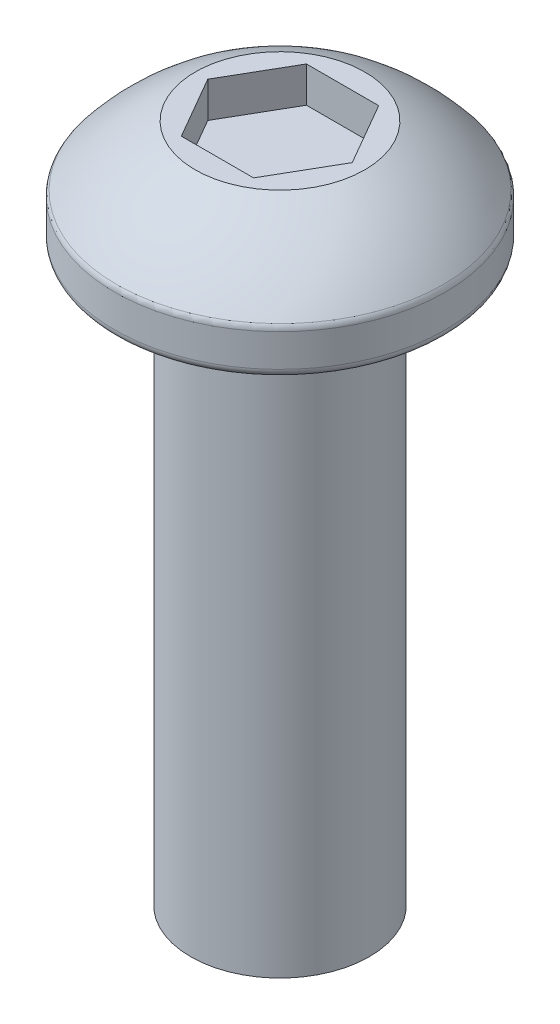
ISO-10303-21;
HEADER;
FILE_DESCRIPTION(('STEP AP214'),'2;1');
FILE_NAME('part.step','',(''),(''),'','','');
FILE_SCHEMA(('AUTOMOTIVE_DESIGN { 1 0 10303 214 1 1 1 1 }'));
ENDSEC;
DATA;
#1=APPLICATION_CONTEXT('core data for automotive mechanical design processes');
#2=APPLICATION_PROTOCOL_DEFINITION('international standard','automotive_design',2000,#1);
#3=PRODUCT_CONTEXT('',#1,'mechanical');
#4=PRODUCT('Part','Part','',(#3));
#5=PRODUCT_RELATED_PRODUCT_CATEGORY('part','',(#4));
#6=PRODUCT_DEFINITION_FORMATION('','',#4);
#7=PRODUCT_DEFINITION_CONTEXT('part definition',#1,'design');
#8=PRODUCT_DEFINITION('design','',#6,#7);
#9=PRODUCT_DEFINITION_SHAPE('','',#8);
#10=(LENGTH_UNIT() NAMED_UNIT(*) SI_UNIT(.MILLI.,.METRE.));
#11=(NAMED_UNIT(*) PLANE_ANGLE_UNIT() SI_UNIT($,.RADIAN.));
#12=(NAMED_UNIT(*) SI_UNIT($,.STERADIAN.) SOLID_ANGLE_UNIT());
#13=UNCERTAINTY_MEASURE_WITH_UNIT(LENGTH_MEASURE(1.E-05),#10,'distance_accuracy_value','');
#14=(GEOMETRIC_REPRESENTATION_CONTEXT(3) GLOBAL_UNCERTAINTY_ASSIGNED_CONTEXT((#13)) GLOBAL_UNIT_ASSIGNED_CONTEXT((#10,
#11,#12)) REPRESENTATION_CONTEXT('',''));
#15=CARTESIAN_POINT('',(0.,0.,0.));
#16=DIRECTION('',(0.,0.,1.));
#17=DIRECTION('',(1.,0.,0.));
#18=AXIS2_PLACEMENT_3D('',#15,#16,#17);
#19=CARTESIAN_POINT('',(2.44951628425305E-11,-2.37847222222222,0.));
#20=DIRECTION('',(0.,1.,0.));
#21=DIRECTION('',(1.,0.,0.));
#22=AXIS2_PLACEMENT_3D('',#19,#20,#21);
#23=SPHERICAL_SURFACE('',#22,5.87847222222222);
#24=CARTESIAN_POINT('',(2.44951628425305E-11,3.,0.));
#25=DIRECTION('',(0.,-1.,0.));
#26=DIRECTION('',(0.,0.,-1.));
#27=AXIS2_PLACEMENT_3D('',#24,#25,#26);
#28=CIRCLE('',#27,2.37244014091446);
#29=CARTESIAN_POINT('',(2.37244014093895,3.,0.));
#30=VERTEX_POINT('',#29);
#31=EDGE_CURVE('E299',#30,#30,#28,.T.);
#32=CARTESIAN_POINT('',(2.44946690335878E-11,1.31986650788977,0.));
#33=DIRECTION('',(0.,-1.,0.));
#34=DIRECTION('',(1.,0.,0.));
#35=AXIS2_PLACEMENT_3D('',#32,#33,#34);
#36=CIRCLE('',#35,4.56932449108092);
#37=CARTESIAN_POINT('',(4.56932449110541,1.31986650788977,0.));
#38=VERTEX_POINT('',#37);
#39=EDGE_CURVE('E43',#38,#38,#36,.F.);
#40=CARTESIAN_POINT('',(2.37244014093895,3.,0.));
#41=CARTESIAN_POINT('',(2.39904857191516,2.98826305932568,0.));
#42=CARTESIAN_POINT('',(2.42556989120355,2.9763286320192,0.));
#43=CARTESIAN_POINT('',(2.47843249583449,2.95206750108271,0.));
#44=CARTESIAN_POINT('',(2.50477378117703,2.93974079745271,0.));
#45=CARTESIAN_POINT('',(2.55727050734604,2.91469781080997,0.));
#46=CARTESIAN_POINT('',(2.5834259481725,2.90198152779724,0.));
#47=CARTESIAN_POINT('',(2.63554522630086,2.87616218829502,0.));
#48=CARTESIAN_POINT('',(2.66150906360275,2.86305913180552,0.));
#49=CARTESIAN_POINT('',(2.71323941503076,2.83646913024654,0.));
#50=CARTESIAN_POINT('',(2.73900592915689,2.82298218517705,0.));
#51=CARTESIAN_POINT('',(2.79033595880942,2.79562737757619,0.));
#52=CARTESIAN_POINT('',(2.81589947433582,2.78175951504482,0.));
#53=CARTESIAN_POINT('',(2.86681787587499,2.75364592709752,0.));
#54=CARTESIAN_POINT('',(2.89217276188776,2.73940020168158,0.));
#55=CARTESIAN_POINT('',(2.9426683194953,2.71053402589361,0.));
#56=CARTESIAN_POINT('',(2.96780899109008,2.69591357552157,0.));
#57=CARTESIAN_POINT('',(3.01787058212758,2.66630117025845,0.));
#58=CARTESIAN_POINT('',(3.04279150157031,2.65130921536738,0.));
#59=CARTESIAN_POINT('',(3.09240809897834,2.62095710334306,0.));
#60=CARTESIAN_POINT('',(3.11710377694365,2.60559694620982,0.));
#61=CARTESIAN_POINT('',(3.16626445168432,2.57451181307959,0.));
#62=CARTESIAN_POINT('',(3.19072944845969,2.55878683708259,0.));
#63=CARTESIAN_POINT('',(3.23942337192035,2.52697552996246,0.));
#64=CARTESIAN_POINT('',(3.26365229860565,2.51088919883931,0.));
#65=CARTESIAN_POINT('',(3.31186874498506,2.47835872479995,0.));
#66=CARTESIAN_POINT('',(3.33585626467917,2.46191458188374,0.));
#67=CARTESIAN_POINT('',(3.38358461334983,2.42867210640647,0.));
#68=CARTESIAN_POINT('',(3.40732544232636,2.41187377384542,0.));
#69=CARTESIAN_POINT('',(3.45455518017396,2.37792661924402,0.));
#70=CARTESIAN_POINT('',(3.47804408904502,2.36077779720367,0.));
#71=CARTESIAN_POINT('',(3.52476481278417,2.32613344101144,0.));
#72=CARTESIAN_POINT('',(3.54799662765225,2.30863790685956,0.));
#73=CARTESIAN_POINT('',(3.594198046118,2.27330398018225,0.));
#74=CARTESIAN_POINT('',(3.61716764971566,2.25546558765683,0.));
#75=CARTESIAN_POINT('',(3.66283958613033,2.21944987349178,0.));
#76=CARTESIAN_POINT('',(3.68554191894733,2.20127255185215,0.));
#77=CARTESIAN_POINT('',(3.73067431316215,2.16458298337387,0.));
#78=CARTESIAN_POINT('',(3.75310437455997,2.14607073653523,0.));
#79=CARTESIAN_POINT('',(3.79768728527104,2.10871539534802,0.));
#80=CARTESIAN_POINT('',(3.81984013458429,2.08987230099945,0.));
#81=CARTESIAN_POINT('',(3.86386374152232,2.05185941535722,0.));
#82=CARTESIAN_POINT('',(3.8857344991471,2.03268962406354,0.));
#83=CARTESIAN_POINT('',(3.92918910524057,1.9940275670574,0.));
#84=CARTESIAN_POINT('',(3.95077295370926,1.97453530134494,0.));
#85=CARTESIAN_POINT('',(3.99364898722024,1.93523258905879,0.));
#86=CARTESIAN_POINT('',(4.01494117226254,1.9154221424851,0.));
#87=CARTESIAN_POINT('',(4.05722918889558,1.87548743212017,0.));
#88=CARTESIAN_POINT('',(4.07822502048632,1.85536316832892,0.));
#89=CARTESIAN_POINT('',(4.1199157054669,1.81480525629534,0.));
#90=CARTESIAN_POINT('',(4.14061055885673,1.79437160805302,0.));
#91=CARTESIAN_POINT('',(4.18169472898976,1.75319942803787,0.));
#92=CARTESIAN_POINT('',(4.20208404573295,1.73246089626505,0.));
#93=CARTESIAN_POINT('',(4.24255265140046,1.69068351724359,0.));
#94=CARTESIAN_POINT('',(4.26263194032478,1.66964466999496,0.));
#95=CARTESIAN_POINT('',(4.30247606757291,1.62727129431111,0.));
#96=CARTESIAN_POINT('',(4.32224090589672,1.6059367658759,0.));
#97=CARTESIAN_POINT('',(4.36145177804986,1.56297672692383,0.));
#98=CARTESIAN_POINT('',(4.38089781187918,1.54135121640697,0.));
#99=CARTESIAN_POINT('',(4.4194667927768,1.49781397766275,0.));
#100=CARTESIAN_POINT('',(4.43858973984509,1.4759022494354,0.));
#101=CARTESIAN_POINT('',(4.47650833087896,1.4317973983138,0.));
#102=CARTESIAN_POINT('',(4.49530397484453,1.40960427541956,0.));
#103=CARTESIAN_POINT('',(4.53256383498748,1.36494153630951,0.));
#104=CARTESIAN_POINT('',(4.55102805116486,1.34247192009371,0.));
#105=CARTESIAN_POINT('',(4.56932449110541,1.31986650788977,0.));
#106=B_SPLINE_CURVE_WITH_KNOTS('',3,(#40,#41,#42,#43,#44,#45,#46,#47,#48,#49,#50,#51,#52,#53,
#54,#55,#56,#57,#58,#59,#60,#61,#62,#63,#64,#65,#66,#67,#68,#69,#70,#71,#72,#73,#74,#75,#76,#77,
#78,#79,#80,#81,#82,#83,#84,#85,#86,#87,#88,#89,#90,#91,#92,#93,#94,#95,#96,#97,#98,#99,#100,
#101,#102,#103,#104,#105),.UNSPECIFIED.,.F.,.F.,(4,2,2,2,2,2,2,2,2,2,2,2,2,2,2,2,2,2,2,2,2,2,2,
2,2,2,2,2,2,2,2,2,4),(0.,0.0872452836910824,0.174490567382165,0.261735851073249,
0.348981134764332,0.436226418455415,0.523471702146498,0.61071698583758,0.697962269528665,
0.785207553219748,0.872452836910831,0.959698120601914,1.046943404293,1.13418868798408,
1.22143397167516,1.30867925536625,1.39592453905733,1.48316982274841,1.5704151064395,
1.65766039013058,1.74490567382166,1.83215095751274,1.91939624120383,2.00664152489491,
2.09388680858599,2.18113209227708,2.26837737596816,2.35562265965924,2.44286794335033,
2.53011322704141,2.61735851073249,2.70460379442358,2.79184907811466),.UNSPECIFIED.);
#107=EDGE_CURVE('BSEAM35',#30,#38,#106,.T.);
#108=ORIENTED_EDGE('',*,*,#31,.T.);
#109=ORIENTED_EDGE('',*,*,#39,.T.);
#110=ORIENTED_EDGE('',*,*,#107,.T.);
#111=ORIENTED_EDGE('',*,*,#107,.F.);
#112=EDGE_LOOP('',(#108,#110,#109,#111));
#113=FACE_BOUND('',#112,.T.);
#114=ADVANCED_FACE('F35',(#113),#23,.T.);
#115=CARTESIAN_POINT('',(0.,21.3223243250921,0.));
#116=DIRECTION('',(0.,1.,0.));
#117=DIRECTION('',(-1.,0.,0.));
#118=AXIS2_PLACEMENT_3D('',#115,#116,#117);
#119=CYLINDRICAL_SURFACE('',#118,2.5);
#120=CARTESIAN_POINT('',(0.,-0.25,0.));
#121=DIRECTION('',(0.,-1.,0.));
#122=DIRECTION('',(1.,0.,0.));
#123=AXIS2_PLACEMENT_3D('',#120,#121,#122);
#124=CIRCLE('',#123,2.5);
#125=CARTESIAN_POINT('',(2.5,-0.25,0.));
#126=VERTEX_POINT('',#125);
#127=EDGE_CURVE('E122',#126,#126,#124,.T.);
#128=ORIENTED_EDGE('',*,*,#127,.T.);
#129=EDGE_LOOP('',(#128));
#130=FACE_BOUND('',#129,.T.);
#131=CARTESIAN_POINT('',(0.,-16.,0.));
#132=DIRECTION('',(0.,1.,0.));
#133=DIRECTION('',(-1.,0.,0.));
#134=AXIS2_PLACEMENT_3D('',#131,#132,#133);
#135=CIRCLE('',#134,2.5);
#136=CARTESIAN_POINT('',(-2.5,-16.,0.));
#137=VERTEX_POINT('',#136);
#138=EDGE_CURVE('E113',#137,#137,#135,.T.);
#139=ORIENTED_EDGE('',*,*,#138,.T.);
#140=EDGE_LOOP('',(#139));
#141=FACE_BOUND('',#140,.T.);
#142=ADVANCED_FACE('F147',(#130,#141),#119,.T.);
#143=CARTESIAN_POINT('',(0.,0.,0.));
#144=DIRECTION('',(0.,-1.,0.));
#145=DIRECTION('',(1.,0.,0.));
#146=AXIS2_PLACEMENT_3D('',#143,#144,#145);
#147=PLANE('',#146);
#148=CARTESIAN_POINT('',(0.,0.,0.));
#149=DIRECTION('',(0.,-1.,0.));
#150=DIRECTION('',(1.,0.,0.));
#151=AXIS2_PLACEMENT_3D('',#148,#149,#150);
#152=CIRCLE('',#151,2.75);
#153=CARTESIAN_POINT('',(2.75,0.,0.));
#154=VERTEX_POINT('',#153);
#155=EDGE_CURVE('E119',#154,#154,#152,.F.);
#156=ORIENTED_EDGE('',*,*,#155,.T.);
#157=EDGE_LOOP('',(#156));
#158=FACE_BOUND('',#157,.T.);
#159=CARTESIAN_POINT('',(0.,0.,0.));
#160=DIRECTION('',(0.,-1.,0.));
#161=DIRECTION('',(1.,0.,0.));
#162=AXIS2_PLACEMENT_3D('',#159,#160,#161);
#163=CIRCLE('',#162,4.37500000002449);
#164=CARTESIAN_POINT('',(4.3750000000245,0.,0.));
#165=VERTEX_POINT('',#164);
#166=EDGE_CURVE('E116',#165,#165,#163,.T.);
#167=ORIENTED_EDGE('',*,*,#166,.T.);
#168=EDGE_LOOP('',(#167));
#169=FACE_BOUND('',#168,.T.);
#170=ADVANCED_FACE('F153',(#158,#169),#147,.T.);
#171=CARTESIAN_POINT('',(0.,21.3223243250921,0.));
#172=DIRECTION('',(0.,1.,0.));
#173=DIRECTION('',(-1.,0.,0.));
#174=AXIS2_PLACEMENT_3D('',#171,#172,#173);
#175=CYLINDRICAL_SURFACE('',#174,4.62500000002449);
#176=CARTESIAN_POINT('',(0.,0.25,0.));
#177=DIRECTION('',(0.,-1.,0.));
#178=DIRECTION('',(1.,0.,0.));
#179=AXIS2_PLACEMENT_3D('',#176,#177,#178);
#180=CIRCLE('',#179,4.62500000002449);
#181=CARTESIAN_POINT('',(4.6250000000245,0.250000000000001,0.));
#182=VERTEX_POINT('',#181);
#183=EDGE_CURVE('E128',#182,#182,#180,.F.);
#184=ORIENTED_EDGE('',*,*,#183,.T.);
#185=EDGE_LOOP('',(#184));
#186=FACE_BOUND('',#185,.T.);
#187=CARTESIAN_POINT('',(0.,1.1625833486652,0.));
#188=DIRECTION('',(0.,-1.,0.));
#189=DIRECTION('',(1.,0.,0.));
#190=AXIS2_PLACEMENT_3D('',#187,#188,#189);
#191=CIRCLE('',#190,4.62500000002449);
#192=CARTESIAN_POINT('',(4.6250000000245,1.1625833486652,0.));
#193=VERTEX_POINT('',#192);
#194=EDGE_CURVE('E125',#193,#193,#191,.T.);
#195=ORIENTED_EDGE('',*,*,#194,.T.);
#196=EDGE_LOOP('',(#195));
#197=FACE_BOUND('',#196,.T.);
#198=ADVANCED_FACE('F161',(#186,#197),#175,.T.);
#199=CARTESIAN_POINT('',(0.,-16.,0.));
#200=DIRECTION('',(0.,-1.,0.));
#201=DIRECTION('',(1.,0.,0.));
#202=AXIS2_PLACEMENT_3D('',#199,#200,#201);
#203=PLANE('',#202);
#204=ORIENTED_EDGE('',*,*,#138,.F.);
#205=EDGE_LOOP('',(#204));
#206=FACE_BOUND('',#205,.T.);
#207=ADVANCED_FACE('F159',(#206),#203,.T.);
#208=CARTESIAN_POINT('',(0.,-0.25,0.));
#209=DIRECTION('',(0.,-1.,0.));
#210=DIRECTION('',(1.,0.,0.));
#211=AXIS2_PLACEMENT_3D('',#208,#209,#210);
#212=TOROIDAL_SURFACE('',#211,2.75,0.25);
#213=ORIENTED_EDGE('',*,*,#127,.F.);
#214=EDGE_LOOP('',(#213));
#215=FACE_BOUND('',#214,.T.);
#216=ORIENTED_EDGE('',*,*,#155,.F.);
#217=EDGE_LOOP('',(#216));
#218=FACE_BOUND('',#217,.T.);
#219=ADVANCED_FACE('F143',(#215,#218),#212,.F.);
#220=CARTESIAN_POINT('',(0.,0.25,0.));
#221=DIRECTION('',(0.,-1.,0.));
#222=DIRECTION('',(1.,0.,0.));
#223=AXIS2_PLACEMENT_3D('',#220,#221,#222);
#224=TOROIDAL_SURFACE('',#223,4.37500000002449,0.25);
#225=ORIENTED_EDGE('',*,*,#166,.F.);
#226=EDGE_LOOP('',(#225));
#227=FACE_BOUND('',#226,.T.);
#228=ORIENTED_EDGE('',*,*,#183,.F.);
#229=EDGE_LOOP('',(#228));
#230=FACE_BOUND('',#229,.T.);
#231=ADVANCED_FACE('F135',(#227,#230),#224,.T.);
#232=CARTESIAN_POINT('',(0.,1.1625833486652,0.));
#233=DIRECTION('',(0.,-1.,0.));
#234=DIRECTION('',(1.,0.,0.));
#235=AXIS2_PLACEMENT_3D('',#232,#233,#234);
#236=TOROIDAL_SURFACE('',#235,4.37500000002449,0.25);
#237=ORIENTED_EDGE('',*,*,#194,.F.);
#238=EDGE_LOOP('',(#237));
#239=FACE_BOUND('',#238,.T.);
#240=ORIENTED_EDGE('',*,*,#39,.F.);
#241=EDGE_LOOP('',(#240));
#242=FACE_BOUND('',#241,.T.);
#243=ADVANCED_FACE('F37',(#239,#242),#236,.T.);
#244=CARTESIAN_POINT('',(-4.62500000002449,3.,-4.62500000002449));
#245=DIRECTION('',(0.,-1.,0.));
#246=DIRECTION('',(0.,0.,-1.));
#247=AXIS2_PLACEMENT_3D('',#244,#245,#246);
#248=PLANE('',#247);
#249=DIRECTION('',(-0.5,0.,0.866025403784439));
#250=VECTOR('',#249,1.);
#251=CARTESIAN_POINT('',(1.01036297108184,3.,1.75));
#252=LINE('',#251,#250);
#253=CARTESIAN_POINT('',(2.02072594216369,3.,0.));
#254=VERTEX_POINT('',#253);
#255=CARTESIAN_POINT('',(1.01036297108184,3.,1.75));
#256=VERTEX_POINT('',#255);
#257=EDGE_CURVE('E49',#254,#256,#252,.T.);
#258=ORIENTED_EDGE('',*,*,#257,.T.);
#259=DIRECTION('',(-1.,0.,0.));
#260=VECTOR('',#259,1.);
#261=CARTESIAN_POINT('',(-1.01036297108185,3.,1.75));
#262=LINE('',#261,#260);
#263=CARTESIAN_POINT('',(-1.01036297108185,3.,1.75));
#264=VERTEX_POINT('',#263);
#265=EDGE_CURVE('E11',#256,#264,#262,.T.);
#266=ORIENTED_EDGE('',*,*,#265,.T.);
#267=DIRECTION('',(-0.5,0.,-0.866025403784439));
#268=VECTOR('',#267,1.);
#269=CARTESIAN_POINT('',(-2.02072594216369,3.,0.));
#270=LINE('',#269,#268);
#271=CARTESIAN_POINT('',(-2.02072594216369,3.,0.));
#272=VERTEX_POINT('',#271);
#273=EDGE_CURVE('E88',#264,#272,#270,.T.);
#274=ORIENTED_EDGE('',*,*,#273,.T.);
#275=DIRECTION('',(0.5,0.,-0.866025403784439));
#276=VECTOR('',#275,1.);
#277=CARTESIAN_POINT('',(-1.01036297108185,3.,-1.75));
#278=LINE('',#277,#276);
#279=CARTESIAN_POINT('',(-1.01036297108185,3.,-1.75));
#280=VERTEX_POINT('',#279);
#281=EDGE_CURVE('E98',#272,#280,#278,.T.);
#282=ORIENTED_EDGE('',*,*,#281,.T.);
#283=DIRECTION('',(1.,0.,0.));
#284=VECTOR('',#283,1.);
#285=CARTESIAN_POINT('',(1.01036297108184,3.,-1.75));
#286=LINE('',#285,#284);
#287=CARTESIAN_POINT('',(1.01036297108184,3.,-1.75));
#288=VERTEX_POINT('',#287);
#289=EDGE_CURVE('E323',#280,#288,#286,.T.);
#290=ORIENTED_EDGE('',*,*,#289,.T.);
#291=DIRECTION('',(0.5,0.,0.866025403784439));
#292=VECTOR('',#291,1.);
#293=CARTESIAN_POINT('',(2.02072594216369,3.,0.));
#294=LINE('',#293,#292);
#295=EDGE_CURVE('E300',#288,#254,#294,.T.);
#296=ORIENTED_EDGE('',*,*,#295,.T.);
#297=EDGE_LOOP('',(#258,#266,#274,#282,#290,#296));
#298=FACE_BOUND('',#297,.T.);
#299=ORIENTED_EDGE('',*,*,#31,.F.);
#300=EDGE_LOOP('',(#299));
#301=FACE_BOUND('',#300,.T.);
#302=ADVANCED_FACE('F86',(#298,#301),#248,.F.);
#303=CARTESIAN_POINT('',(0.,2.,0.));
#304=DIRECTION('',(0.,1.,0.));
#305=DIRECTION('',(-1.,0.,0.));
#306=AXIS2_PLACEMENT_3D('',#303,#304,#305);
#307=PLANE('',#306);
#308=DIRECTION('',(0.5,0.,-0.866025403784439));
#309=VECTOR('',#308,1.);
#310=CARTESIAN_POINT('',(1.01036297108184,2.,1.75));
#311=LINE('',#310,#309);
#312=CARTESIAN_POINT('',(1.01036297108184,2.,1.75));
#313=VERTEX_POINT('',#312);
#314=CARTESIAN_POINT('',(2.02072594216369,2.,0.));
#315=VERTEX_POINT('',#314);
#316=EDGE_CURVE('E310',#313,#315,#311,.T.);
#317=ORIENTED_EDGE('',*,*,#316,.T.);
#318=DIRECTION('',(-0.5,0.,-0.866025403784439));
#319=VECTOR('',#318,1.);
#320=CARTESIAN_POINT('',(2.02072594216369,2.,0.));
#321=LINE('',#320,#319);
#322=CARTESIAN_POINT('',(1.01036297108184,2.,-1.75));
#323=VERTEX_POINT('',#322);
#324=EDGE_CURVE('E305',#315,#323,#321,.T.);
#325=ORIENTED_EDGE('',*,*,#324,.T.);
#326=DIRECTION('',(-1.,0.,0.));
#327=VECTOR('',#326,1.);
#328=CARTESIAN_POINT('',(1.01036297108184,2.,-1.75));
#329=LINE('',#328,#327);
#330=CARTESIAN_POINT('',(-1.01036297108185,2.,-1.75));
#331=VERTEX_POINT('',#330);
#332=EDGE_CURVE('E309',#323,#331,#329,.T.);
#333=ORIENTED_EDGE('',*,*,#332,.T.);
#334=DIRECTION('',(-0.5,0.,0.866025403784438));
#335=VECTOR('',#334,1.);
#336=CARTESIAN_POINT('',(-1.01036297108185,2.,-1.75));
#337=LINE('',#336,#335);
#338=CARTESIAN_POINT('',(-2.02072594216369,2.,0.));
#339=VERTEX_POINT('',#338);
#340=EDGE_CURVE('E316',#331,#339,#337,.T.);
#341=ORIENTED_EDGE('',*,*,#340,.T.);
#342=DIRECTION('',(0.5,0.,0.866025403784439));
#343=VECTOR('',#342,1.);
#344=CARTESIAN_POINT('',(-2.02072594216369,2.,0.));
#345=LINE('',#344,#343);
#346=CARTESIAN_POINT('',(-1.01036297108185,2.,1.75));
#347=VERTEX_POINT('',#346);
#348=EDGE_CURVE('E319',#339,#347,#345,.T.);
#349=ORIENTED_EDGE('',*,*,#348,.T.);
#350=DIRECTION('',(1.,0.,0.));
#351=VECTOR('',#350,1.);
#352=CARTESIAN_POINT('',(-1.01036297108185,2.,1.75));
#353=LINE('',#352,#351);
#354=EDGE_CURVE('E101',#347,#313,#353,.T.);
#355=ORIENTED_EDGE('',*,*,#354,.T.);
#356=EDGE_LOOP('',(#317,#325,#333,#341,#349,#355));
#357=FACE_BOUND('',#356,.T.);
#358=ADVANCED_FACE('F141',(#357),#307,.T.);
#359=CARTESIAN_POINT('',(-1.01036297108185,5.,1.75));
#360=DIRECTION('',(0.,0.,-1.));
#361=DIRECTION('',(-1.,0.,0.));
#362=AXIS2_PLACEMENT_3D('',#359,#360,#361);
#363=PLANE('',#362);
#364=ORIENTED_EDGE('',*,*,#265,.F.);
#365=DIRECTION('',(0.,-1.,0.));
#366=VECTOR('',#365,1.);
#367=CARTESIAN_POINT('',(1.01036297108184,5.,1.75));
#368=LINE('',#367,#366);
#369=EDGE_CURVE('E56',#256,#313,#368,.T.);
#370=ORIENTED_EDGE('',*,*,#369,.T.);
#371=ORIENTED_EDGE('',*,*,#354,.F.);
#372=DIRECTION('',(0.,-1.,0.));
#373=VECTOR('',#372,1.);
#374=CARTESIAN_POINT('',(-1.01036297108185,5.,1.75));
#375=LINE('',#374,#373);
#376=EDGE_CURVE('E95',#264,#347,#375,.T.);
#377=ORIENTED_EDGE('',*,*,#376,.F.);
#378=EDGE_LOOP('',(#364,#370,#371,#377));
#379=FACE_BOUND('',#378,.T.);
#380=ADVANCED_FACE('F100',(#379),#363,.T.);
#381=CARTESIAN_POINT('',(-2.02072594216369,5.,0.));
#382=DIRECTION('',(0.866025403784439,0.,-0.5));
#383=DIRECTION('',(-0.5,0.,-0.866025403784439));
#384=AXIS2_PLACEMENT_3D('',#381,#382,#383);
#385=PLANE('',#384);
#386=ORIENTED_EDGE('',*,*,#273,.F.);
#387=ORIENTED_EDGE('',*,*,#376,.T.);
#388=ORIENTED_EDGE('',*,*,#348,.F.);
#389=DIRECTION('',(0.,-1.,0.));
#390=VECTOR('',#389,1.);
#391=CARTESIAN_POINT('',(-2.02072594216369,5.,0.));
#392=LINE('',#391,#390);
#393=EDGE_CURVE('E97',#272,#339,#392,.T.);
#394=ORIENTED_EDGE('',*,*,#393,.F.);
#395=EDGE_LOOP('',(#386,#387,#388,#394));
#396=FACE_BOUND('',#395,.T.);
#397=ADVANCED_FACE('F93',(#396),#385,.T.);
#398=CARTESIAN_POINT('',(-1.01036297108185,5.,-1.75));
#399=DIRECTION('',(0.866025403784439,0.,0.5));
#400=DIRECTION('',(0.5,0.,-0.866025403784439));
#401=AXIS2_PLACEMENT_3D('',#398,#399,#400);
#402=PLANE('',#401);
#403=ORIENTED_EDGE('',*,*,#281,.F.);
#404=ORIENTED_EDGE('',*,*,#393,.T.);
#405=ORIENTED_EDGE('',*,*,#340,.F.);
#406=DIRECTION('',(0.,-1.,0.));
#407=VECTOR('',#406,1.);
#408=CARTESIAN_POINT('',(-1.01036297108185,5.,-1.75));
#409=LINE('',#408,#407);
#410=EDGE_CURVE('E103',#280,#331,#409,.T.);
#411=ORIENTED_EDGE('',*,*,#410,.F.);
#412=EDGE_LOOP('',(#403,#404,#405,#411));
#413=FACE_BOUND('',#412,.T.);
#414=ADVANCED_FACE('F224',(#413),#402,.T.);
#415=CARTESIAN_POINT('',(1.01036297108184,5.,-1.75));
#416=DIRECTION('',(0.,0.,1.));
#417=DIRECTION('',(1.,0.,0.));
#418=AXIS2_PLACEMENT_3D('',#415,#416,#417);
#419=PLANE('',#418);
#420=ORIENTED_EDGE('',*,*,#289,.F.);
#421=ORIENTED_EDGE('',*,*,#410,.T.);
#422=ORIENTED_EDGE('',*,*,#332,.F.);
#423=DIRECTION('',(0.,-1.,0.));
#424=VECTOR('',#423,1.);
#425=CARTESIAN_POINT('',(1.01036297108184,5.,-1.75));
#426=LINE('',#425,#424);
#427=EDGE_CURVE('E109',#288,#323,#426,.T.);
#428=ORIENTED_EDGE('',*,*,#427,.F.);
#429=EDGE_LOOP('',(#420,#421,#422,#428));
#430=FACE_BOUND('',#429,.T.);
#431=ADVANCED_FACE('F231',(#430),#419,.T.);
#432=CARTESIAN_POINT('',(2.02072594216369,5.,0.));
#433=DIRECTION('',(-0.866025403784439,0.,0.5));
#434=DIRECTION('',(0.5,0.,0.866025403784439));
#435=AXIS2_PLACEMENT_3D('',#432,#433,#434);
#436=PLANE('',#435);
#437=ORIENTED_EDGE('',*,*,#295,.F.);
#438=ORIENTED_EDGE('',*,*,#427,.T.);
#439=ORIENTED_EDGE('',*,*,#324,.F.);
#440=DIRECTION('',(0.,-1.,0.));
#441=VECTOR('',#440,1.);
#442=CARTESIAN_POINT('',(2.02072594216369,5.,0.));
#443=LINE('',#442,#441);
#444=EDGE_CURVE('E111',#254,#315,#443,.T.);
#445=ORIENTED_EDGE('',*,*,#444,.F.);
#446=EDGE_LOOP('',(#437,#438,#439,#445));
#447=FACE_BOUND('',#446,.T.);
#448=ADVANCED_FACE('F239',(#447),#436,.T.);
#449=CARTESIAN_POINT('',(1.01036297108184,5.,1.75));
#450=DIRECTION('',(-0.866025403784439,0.,-0.5));
#451=DIRECTION('',(-0.5,0.,0.866025403784439));
#452=AXIS2_PLACEMENT_3D('',#449,#450,#451);
#453=PLANE('',#452);
#454=ORIENTED_EDGE('',*,*,#257,.F.);
#455=ORIENTED_EDGE('',*,*,#444,.T.);
#456=ORIENTED_EDGE('',*,*,#316,.F.);
#457=ORIENTED_EDGE('',*,*,#369,.F.);
#458=EDGE_LOOP('',(#454,#455,#456,#457));
#459=FACE_BOUND('',#458,.T.);
#460=ADVANCED_FACE('F247',(#459),#453,.T.);
#461=CLOSED_SHELL('',(#114,#142,#170,#198,#207,#219,#231,#243,#302,#358,#380,#397,#414,#431,
#448,#460));
#462=MANIFOLD_SOLID_BREP('B2',#461);
#463=ADVANCED_BREP_SHAPE_REPRESENTATION('',(#18,#462),#14);
#464=SHAPE_DEFINITION_REPRESENTATION(#9,#463);
ENDSEC;
END-ISO-10303-21;
